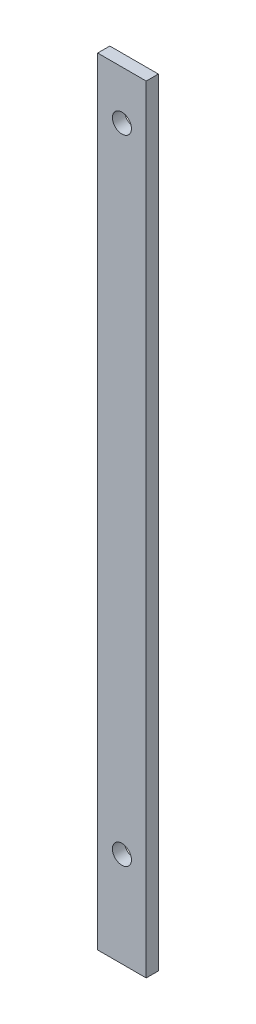
ISO-10303-21;
HEADER;
FILE_DESCRIPTION(('STEP AP214'),'2;1');
FILE_NAME('part.step','',(''),(''),'','','');
FILE_SCHEMA(('AUTOMOTIVE_DESIGN { 1 0 10303 214 1 1 1 1 }'));
ENDSEC;
DATA;
#1=APPLICATION_CONTEXT('core data for automotive mechanical design processes');
#2=APPLICATION_PROTOCOL_DEFINITION('international standard','automotive_design',2000,#1);
#3=PRODUCT_CONTEXT('',#1,'mechanical');
#4=PRODUCT('Part','Part','',(#3));
#5=PRODUCT_RELATED_PRODUCT_CATEGORY('part','',(#4));
#6=PRODUCT_DEFINITION_FORMATION('','',#4);
#7=PRODUCT_DEFINITION_CONTEXT('part definition',#1,'design');
#8=PRODUCT_DEFINITION('design','',#6,#7);
#9=PRODUCT_DEFINITION_SHAPE('','',#8);
#10=(LENGTH_UNIT() NAMED_UNIT(*) SI_UNIT(.MILLI.,.METRE.));
#11=(NAMED_UNIT(*) PLANE_ANGLE_UNIT() SI_UNIT($,.RADIAN.));
#12=(NAMED_UNIT(*) SI_UNIT($,.STERADIAN.) SOLID_ANGLE_UNIT());
#13=UNCERTAINTY_MEASURE_WITH_UNIT(LENGTH_MEASURE(1.E-05),#10,'distance_accuracy_value','');
#14=(GEOMETRIC_REPRESENTATION_CONTEXT(3) GLOBAL_UNCERTAINTY_ASSIGNED_CONTEXT((#13)) GLOBAL_UNIT_ASSIGNED_CONTEXT((#10,
#11,#12)) REPRESENTATION_CONTEXT('',''));
#15=CARTESIAN_POINT('',(0.,0.,0.));
#16=DIRECTION('',(0.,0.,1.));
#17=DIRECTION('',(1.,0.,0.));
#18=AXIS2_PLACEMENT_3D('',#15,#16,#17);
#19=CARTESIAN_POINT('',(-19.0499999999559,101.6,3.175));
#20=DIRECTION('',(0.,-1.,0.));
#21=DIRECTION('',(0.,0.,-1.));
#22=AXIS2_PLACEMENT_3D('',#19,#20,#21);
#23=PLANE('',#22);
#24=DIRECTION('',(-1.,0.,0.));
#25=VECTOR('',#24,1.);
#26=CARTESIAN_POINT('',(-19.0499999999559,101.6,0.));
#27=LINE('',#26,#25);
#28=CARTESIAN_POINT('',(-6.34999999995591,101.6,0.));
#29=VERTEX_POINT('',#28);
#30=CARTESIAN_POINT('',(-19.0499999999559,101.6,0.));
#31=VERTEX_POINT('',#30);
#32=EDGE_CURVE('E100',#29,#31,#27,.T.);
#33=ORIENTED_EDGE('',*,*,#32,.T.);
#34=DIRECTION('',(0.,0.,-1.));
#35=VECTOR('',#34,1.);
#36=CARTESIAN_POINT('',(-19.0499999999559,101.6,3.175));
#37=LINE('',#36,#35);
#38=CARTESIAN_POINT('',(-19.0499999999559,101.6,3.175));
#39=VERTEX_POINT('',#38);
#40=EDGE_CURVE('E11',#39,#31,#37,.T.);
#41=ORIENTED_EDGE('',*,*,#40,.F.);
#42=DIRECTION('',(-1.,0.,0.));
#43=VECTOR('',#42,1.);
#44=CARTESIAN_POINT('',(-19.0499999999559,101.6,3.175));
#45=LINE('',#44,#43);
#46=CARTESIAN_POINT('',(-6.34999999995591,101.6,3.175));
#47=VERTEX_POINT('',#46);
#48=EDGE_CURVE('E88',#47,#39,#45,.T.);
#49=ORIENTED_EDGE('',*,*,#48,.F.);
#50=DIRECTION('',(0.,0.,-1.));
#51=VECTOR('',#50,1.);
#52=CARTESIAN_POINT('',(-6.34999999995591,101.6,3.175));
#53=LINE('',#52,#51);
#54=EDGE_CURVE('E96',#47,#29,#53,.T.);
#55=ORIENTED_EDGE('',*,*,#54,.T.);
#56=EDGE_LOOP('',(#33,#41,#49,#55));
#57=FACE_BOUND('',#56,.T.);
#58=ADVANCED_FACE('F37',(#57),#23,.F.);
#59=CARTESIAN_POINT('',(-19.0499999999559,101.6,3.175));
#60=DIRECTION('',(1.,0.,0.));
#61=DIRECTION('',(0.,0.,-1.));
#62=AXIS2_PLACEMENT_3D('',#59,#60,#61);
#63=PLANE('',#62);
#64=DIRECTION('',(0.,-1.,0.));
#65=VECTOR('',#64,1.);
#66=CARTESIAN_POINT('',(-19.0499999999559,101.6,0.));
#67=LINE('',#66,#65);
#68=CARTESIAN_POINT('',(-19.0499999999559,-101.6,0.));
#69=VERTEX_POINT('',#68);
#70=EDGE_CURVE('E92',#31,#69,#67,.T.);
#71=ORIENTED_EDGE('',*,*,#70,.T.);
#72=DIRECTION('',(0.,0.,-1.));
#73=VECTOR('',#72,1.);
#74=CARTESIAN_POINT('',(-19.0499999999559,-101.6,3.175));
#75=LINE('',#74,#73);
#76=CARTESIAN_POINT('',(-19.0499999999559,-101.6,3.175));
#77=VERTEX_POINT('',#76);
#78=EDGE_CURVE('E45',#77,#69,#75,.T.);
#79=ORIENTED_EDGE('',*,*,#78,.F.);
#80=DIRECTION('',(0.,-1.,0.));
#81=VECTOR('',#80,1.);
#82=CARTESIAN_POINT('',(-19.0499999999559,101.6,3.175));
#83=LINE('',#82,#81);
#84=EDGE_CURVE('E83',#39,#77,#83,.T.);
#85=ORIENTED_EDGE('',*,*,#84,.F.);
#86=ORIENTED_EDGE('',*,*,#40,.T.);
#87=EDGE_LOOP('',(#71,#79,#85,#86));
#88=FACE_BOUND('',#87,.T.);
#89=ADVANCED_FACE('F91',(#88),#63,.F.);
#90=CARTESIAN_POINT('',(-19.0499999999559,-101.6,3.175));
#91=DIRECTION('',(0.,1.,0.));
#92=DIRECTION('',(0.,0.,1.));
#93=AXIS2_PLACEMENT_3D('',#90,#91,#92);
#94=PLANE('',#93);
#95=DIRECTION('',(1.,0.,0.));
#96=VECTOR('',#95,1.);
#97=CARTESIAN_POINT('',(-19.0499999999559,-101.6,0.));
#98=LINE('',#97,#96);
#99=CARTESIAN_POINT('',(-6.34999999995591,-101.6,0.));
#100=VERTEX_POINT('',#99);
#101=EDGE_CURVE('E70',#69,#100,#98,.T.);
#102=ORIENTED_EDGE('',*,*,#101,.T.);
#103=DIRECTION('',(0.,0.,-1.));
#104=VECTOR('',#103,1.);
#105=CARTESIAN_POINT('',(-6.34999999995591,-101.6,3.175));
#106=LINE('',#105,#104);
#107=CARTESIAN_POINT('',(-6.34999999995591,-101.6,3.175));
#108=VERTEX_POINT('',#107);
#109=EDGE_CURVE('E93',#108,#100,#106,.T.);
#110=ORIENTED_EDGE('',*,*,#109,.F.);
#111=DIRECTION('',(1.,0.,0.));
#112=VECTOR('',#111,1.);
#113=CARTESIAN_POINT('',(-19.0499999999559,-101.6,3.175));
#114=LINE('',#113,#112);
#115=EDGE_CURVE('E86',#77,#108,#114,.T.);
#116=ORIENTED_EDGE('',*,*,#115,.F.);
#117=ORIENTED_EDGE('',*,*,#78,.T.);
#118=EDGE_LOOP('',(#102,#110,#116,#117));
#119=FACE_BOUND('',#118,.T.);
#120=ADVANCED_FACE('F94',(#119),#94,.F.);
#121=CARTESIAN_POINT('',(-6.34999999995591,101.6,3.175));
#122=DIRECTION('',(-1.,0.,0.));
#123=DIRECTION('',(0.,0.,1.));
#124=AXIS2_PLACEMENT_3D('',#121,#122,#123);
#125=PLANE('',#124);
#126=DIRECTION('',(0.,1.,0.));
#127=VECTOR('',#126,1.);
#128=CARTESIAN_POINT('',(-6.34999999995591,101.6,0.));
#129=LINE('',#128,#127);
#130=EDGE_CURVE('E76',#100,#29,#129,.T.);
#131=ORIENTED_EDGE('',*,*,#130,.T.);
#132=ORIENTED_EDGE('',*,*,#54,.F.);
#133=DIRECTION('',(0.,1.,0.));
#134=VECTOR('',#133,1.);
#135=CARTESIAN_POINT('',(-6.34999999995591,101.6,3.175));
#136=LINE('',#135,#134);
#137=EDGE_CURVE('E53',#108,#47,#136,.T.);
#138=ORIENTED_EDGE('',*,*,#137,.F.);
#139=ORIENTED_EDGE('',*,*,#109,.T.);
#140=EDGE_LOOP('',(#131,#132,#138,#139));
#141=FACE_BOUND('',#140,.T.);
#142=ADVANCED_FACE('F108',(#141),#125,.F.);
#143=CARTESIAN_POINT('',(0.,0.,3.175));
#144=DIRECTION('',(0.,0.,-1.));
#145=DIRECTION('',(-1.,0.,0.));
#146=AXIS2_PLACEMENT_3D('',#143,#144,#145);
#147=PLANE('',#146);
#148=CARTESIAN_POINT('',(-12.6999999999559,88.9,3.175));
#149=DIRECTION('',(0.,0.,1.));
#150=DIRECTION('',(1.,0.,0.));
#151=AXIS2_PLACEMENT_3D('',#148,#149,#150);
#152=CIRCLE('',#151,2.48919999999999);
#153=CARTESIAN_POINT('',(-10.2107999999559,88.9,3.175));
#154=VERTEX_POINT('',#153);
#155=EDGE_CURVE('E122',#154,#154,#152,.T.);
#156=ORIENTED_EDGE('',*,*,#155,.F.);
#157=EDGE_LOOP('',(#156));
#158=FACE_BOUND('',#157,.T.);
#159=CARTESIAN_POINT('',(-12.6999999999559,-76.7542569910273,3.175));
#160=DIRECTION('',(0.,0.,1.));
#161=DIRECTION('',(1.,0.,0.));
#162=AXIS2_PLACEMENT_3D('',#159,#160,#161);
#163=CIRCLE('',#162,2.4892);
#164=CARTESIAN_POINT('',(-10.2107999999559,-76.7542569910273,3.175));
#165=VERTEX_POINT('',#164);
#166=EDGE_CURVE('E116',#165,#165,#163,.T.);
#167=ORIENTED_EDGE('',*,*,#166,.F.);
#168=EDGE_LOOP('',(#167));
#169=FACE_BOUND('',#168,.T.);
#170=ORIENTED_EDGE('',*,*,#48,.T.);
#171=ORIENTED_EDGE('',*,*,#84,.T.);
#172=ORIENTED_EDGE('',*,*,#115,.T.);
#173=ORIENTED_EDGE('',*,*,#137,.T.);
#174=EDGE_LOOP('',(#170,#171,#172,#173));
#175=FACE_BOUND('',#174,.T.);
#176=ADVANCED_FACE('F84',(#158,#169,#175),#147,.F.);
#177=CARTESIAN_POINT('',(0.,0.,0.));
#178=DIRECTION('',(0.,0.,-1.));
#179=DIRECTION('',(-1.,0.,0.));
#180=AXIS2_PLACEMENT_3D('',#177,#178,#179);
#181=PLANE('',#180);
#182=CARTESIAN_POINT('',(-12.6999999999559,88.9,0.));
#183=DIRECTION('',(0.,0.,1.));
#184=DIRECTION('',(1.,0.,0.));
#185=AXIS2_PLACEMENT_3D('',#182,#183,#184);
#186=CIRCLE('',#185,2.4892);
#187=CARTESIAN_POINT('',(-10.2107999999559,88.9,0.));
#188=VERTEX_POINT('',#187);
#189=EDGE_CURVE('E119',#188,#188,#186,.T.);
#190=ORIENTED_EDGE('',*,*,#189,.T.);
#191=EDGE_LOOP('',(#190));
#192=FACE_BOUND('',#191,.T.);
#193=CARTESIAN_POINT('',(-12.6999999999559,-76.7542569910273,0.));
#194=DIRECTION('',(0.,0.,1.));
#195=DIRECTION('',(1.,0.,0.));
#196=AXIS2_PLACEMENT_3D('',#193,#194,#195);
#197=CIRCLE('',#196,2.4892);
#198=CARTESIAN_POINT('',(-10.2107999999559,-76.7542569910273,0.));
#199=VERTEX_POINT('',#198);
#200=EDGE_CURVE('E103',#199,#199,#197,.T.);
#201=ORIENTED_EDGE('',*,*,#200,.T.);
#202=EDGE_LOOP('',(#201));
#203=FACE_BOUND('',#202,.T.);
#204=ORIENTED_EDGE('',*,*,#32,.F.);
#205=ORIENTED_EDGE('',*,*,#130,.F.);
#206=ORIENTED_EDGE('',*,*,#101,.F.);
#207=ORIENTED_EDGE('',*,*,#70,.F.);
#208=EDGE_LOOP('',(#204,#205,#206,#207));
#209=FACE_BOUND('',#208,.T.);
#210=ADVANCED_FACE('F111',(#192,#203,#209),#181,.T.);
#211=CARTESIAN_POINT('',(-12.6999999999559,-76.7542569910273,3.175));
#212=DIRECTION('',(0.,0.,1.));
#213=DIRECTION('',(1.,0.,0.));
#214=AXIS2_PLACEMENT_3D('',#211,#212,#213);
#215=CYLINDRICAL_SURFACE('',#214,2.4892);
#216=ORIENTED_EDGE('',*,*,#200,.F.);
#217=EDGE_LOOP('',(#216));
#218=FACE_BOUND('',#217,.T.);
#219=ORIENTED_EDGE('',*,*,#166,.T.);
#220=EDGE_LOOP('',(#219));
#221=FACE_BOUND('',#220,.T.);
#222=ADVANCED_FACE('F133',(#218,#221),#215,.F.);
#223=CARTESIAN_POINT('',(-12.6999999999559,88.9,3.175));
#224=DIRECTION('',(0.,0.,1.));
#225=DIRECTION('',(1.,0.,0.));
#226=AXIS2_PLACEMENT_3D('',#223,#224,#225);
#227=CYLINDRICAL_SURFACE('',#226,2.48919999999999);
#228=ORIENTED_EDGE('',*,*,#189,.F.);
#229=EDGE_LOOP('',(#228));
#230=FACE_BOUND('',#229,.T.);
#231=ORIENTED_EDGE('',*,*,#155,.T.);
#232=EDGE_LOOP('',(#231));
#233=FACE_BOUND('',#232,.T.);
#234=ADVANCED_FACE('F126',(#230,#233),#227,.F.);
#235=CLOSED_SHELL('',(#58,#89,#120,#142,#176,#210,#222,#234));
#236=MANIFOLD_SOLID_BREP('B2',#235);
#237=ADVANCED_BREP_SHAPE_REPRESENTATION('',(#18,#236),#14);
#238=SHAPE_DEFINITION_REPRESENTATION(#9,#237);
ENDSEC;
END-ISO-10303-21;
